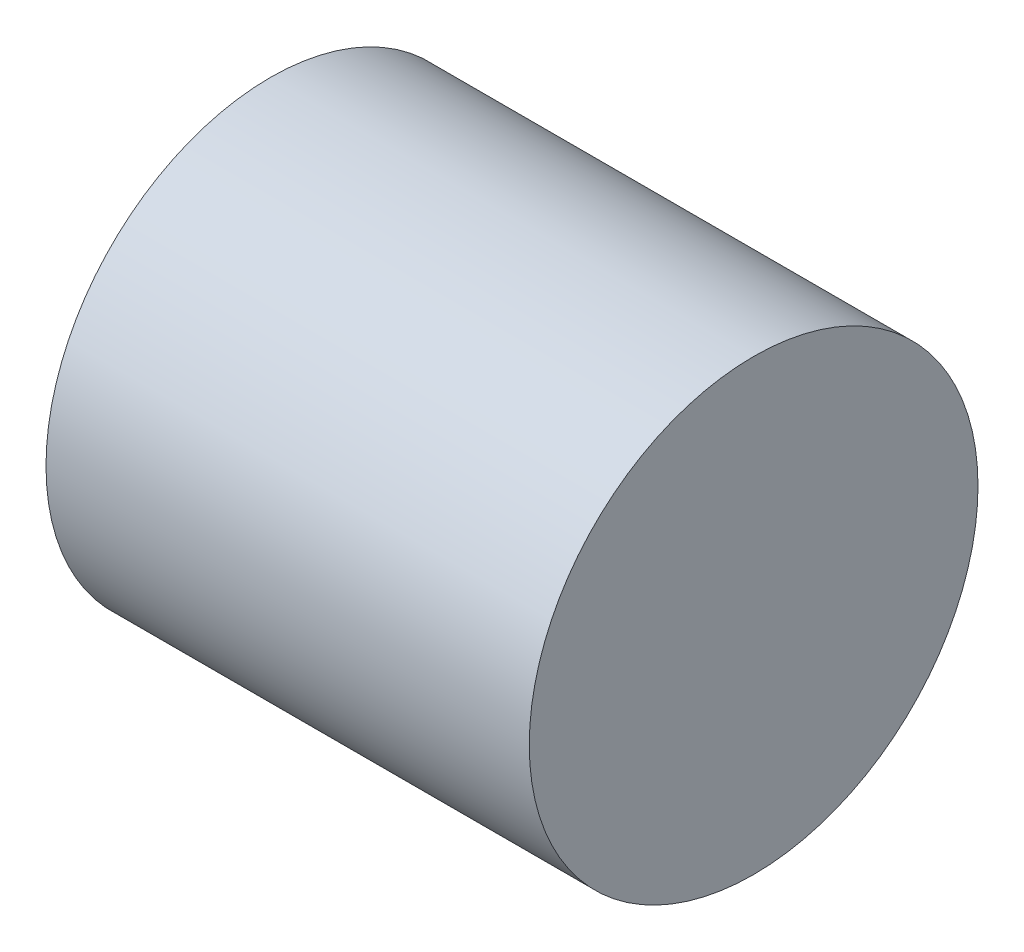
ISO-10303-21;
HEADER;
FILE_DESCRIPTION(('STEP AP214'),'2;1');
FILE_NAME('part.step','',(''),(''),'','','');
FILE_SCHEMA(('AUTOMOTIVE_DESIGN { 1 0 10303 214 1 1 1 1 }'));
ENDSEC;
DATA;
#1=APPLICATION_CONTEXT('core data for automotive mechanical design processes');
#2=APPLICATION_PROTOCOL_DEFINITION('international standard','automotive_design',2000,#1);
#3=PRODUCT_CONTEXT('',#1,'mechanical');
#4=PRODUCT('Part','Part','',(#3));
#5=PRODUCT_RELATED_PRODUCT_CATEGORY('part','',(#4));
#6=PRODUCT_DEFINITION_FORMATION('','',#4);
#7=PRODUCT_DEFINITION_CONTEXT('part definition',#1,'design');
#8=PRODUCT_DEFINITION('design','',#6,#7);
#9=PRODUCT_DEFINITION_SHAPE('','',#8);
#10=(LENGTH_UNIT() NAMED_UNIT(*) SI_UNIT(.MILLI.,.METRE.));
#11=(NAMED_UNIT(*) PLANE_ANGLE_UNIT() SI_UNIT($,.RADIAN.));
#12=(NAMED_UNIT(*) SI_UNIT($,.STERADIAN.) SOLID_ANGLE_UNIT());
#13=UNCERTAINTY_MEASURE_WITH_UNIT(LENGTH_MEASURE(1.E-05),#10,'distance_accuracy_value','');
#14=(GEOMETRIC_REPRESENTATION_CONTEXT(3) GLOBAL_UNCERTAINTY_ASSIGNED_CONTEXT((#13)) GLOBAL_UNIT_ASSIGNED_CONTEXT((#10,
#11,#12)) REPRESENTATION_CONTEXT('',''));
#15=CARTESIAN_POINT('',(0.,0.,0.));
#16=DIRECTION('',(0.,0.,1.));
#17=DIRECTION('',(1.,0.,0.));
#18=AXIS2_PLACEMENT_3D('',#15,#16,#17);
#19=CARTESIAN_POINT('',(7.,0.,0.));
#20=DIRECTION('',(-1.,0.,0.));
#21=DIRECTION('',(0.,0.,1.));
#22=AXIS2_PLACEMENT_3D('',#19,#20,#21);
#23=CYLINDRICAL_SURFACE('',#22,3.25);
#24=CARTESIAN_POINT('',(7.,0.,0.));
#25=DIRECTION('',(1.,0.,0.));
#26=DIRECTION('',(0.,0.,-1.));
#27=AXIS2_PLACEMENT_3D('',#24,#25,#26);
#28=CIRCLE('',#27,3.25);
#29=CARTESIAN_POINT('',(7.,0.,-3.25));
#30=VERTEX_POINT('',#29);
#31=EDGE_CURVE('E10',#30,#30,#28,.T.);
#32=ORIENTED_EDGE('',*,*,#31,.F.);
#33=EDGE_LOOP('',(#32));
#34=FACE_BOUND('',#33,.T.);
#35=CARTESIAN_POINT('',(0.,0.,0.));
#36=DIRECTION('',(1.,0.,0.));
#37=DIRECTION('',(0.,0.,-1.));
#38=AXIS2_PLACEMENT_3D('',#35,#36,#37);
#39=CIRCLE('',#38,3.25);
#40=CARTESIAN_POINT('',(0.,0.,-3.25));
#41=VERTEX_POINT('',#40);
#42=EDGE_CURVE('E35',#41,#41,#39,.T.);
#43=ORIENTED_EDGE('',*,*,#42,.T.);
#44=EDGE_LOOP('',(#43));
#45=FACE_BOUND('',#44,.T.);
#46=ADVANCED_FACE('F32',(#34,#45),#23,.T.);
#47=CARTESIAN_POINT('',(7.,0.,0.));
#48=DIRECTION('',(1.,0.,0.));
#49=DIRECTION('',(0.,0.,-1.));
#50=AXIS2_PLACEMENT_3D('',#47,#48,#49);
#51=PLANE('',#50);
#52=ORIENTED_EDGE('',*,*,#31,.T.);
#53=EDGE_LOOP('',(#52));
#54=FACE_BOUND('',#53,.T.);
#55=ADVANCED_FACE('F47',(#54),#51,.T.);
#56=CARTESIAN_POINT('',(0.,0.,0.));
#57=DIRECTION('',(1.,0.,0.));
#58=DIRECTION('',(0.,0.,-1.));
#59=AXIS2_PLACEMENT_3D('',#56,#57,#58);
#60=PLANE('',#59);
#61=ORIENTED_EDGE('',*,*,#42,.F.);
#62=EDGE_LOOP('',(#61));
#63=FACE_BOUND('',#62,.T.);
#64=ADVANCED_FACE('F45',(#63),#60,.F.);
#65=CLOSED_SHELL('',(#46,#55,#64));
#66=MANIFOLD_SOLID_BREP('B2',#65);
#67=ADVANCED_BREP_SHAPE_REPRESENTATION('',(#18,#66),#14);
#68=SHAPE_DEFINITION_REPRESENTATION(#9,#67);
ENDSEC;
END-ISO-10303-21;
